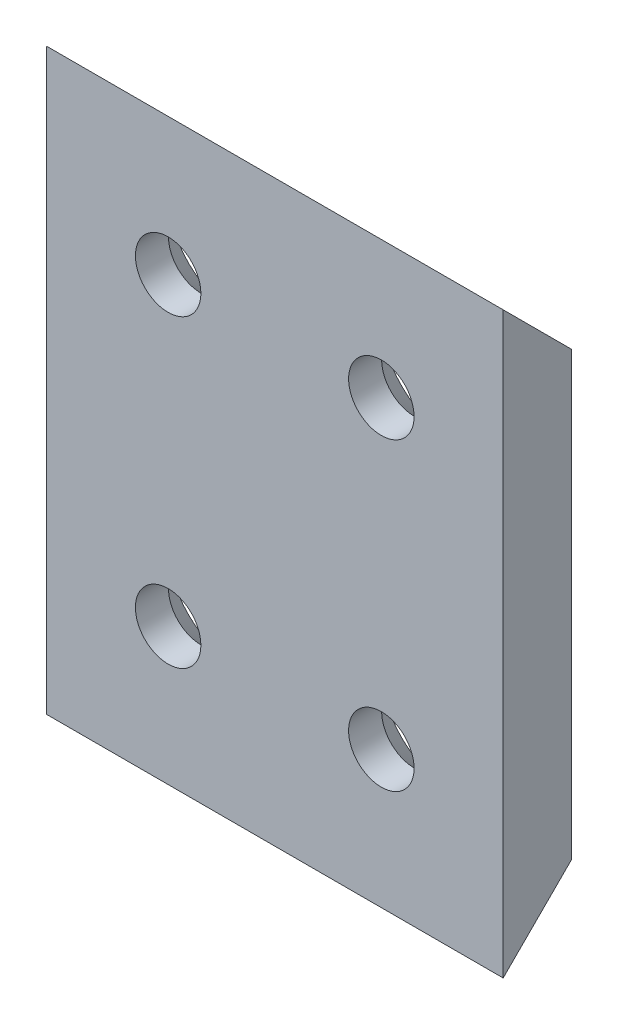
ISO-10303-21;
HEADER;
FILE_DESCRIPTION(('STEP AP214'),'2;1');
FILE_NAME('part.step','',(''),(''),'','','');
FILE_SCHEMA(('AUTOMOTIVE_DESIGN { 1 0 10303 214 1 1 1 1 }'));
ENDSEC;
DATA;
#1=APPLICATION_CONTEXT('core data for automotive mechanical design processes');
#2=APPLICATION_PROTOCOL_DEFINITION('international standard','automotive_design',2000,#1);
#3=PRODUCT_CONTEXT('',#1,'mechanical');
#4=PRODUCT('Part','Part','',(#3));
#5=PRODUCT_RELATED_PRODUCT_CATEGORY('part','',(#4));
#6=PRODUCT_DEFINITION_FORMATION('','',#4);
#7=PRODUCT_DEFINITION_CONTEXT('part definition',#1,'design');
#8=PRODUCT_DEFINITION('design','',#6,#7);
#9=PRODUCT_DEFINITION_SHAPE('','',#8);
#10=(LENGTH_UNIT() NAMED_UNIT(*) SI_UNIT(.MILLI.,.METRE.));
#11=(NAMED_UNIT(*) PLANE_ANGLE_UNIT() SI_UNIT($,.RADIAN.));
#12=(NAMED_UNIT(*) SI_UNIT($,.STERADIAN.) SOLID_ANGLE_UNIT());
#13=UNCERTAINTY_MEASURE_WITH_UNIT(LENGTH_MEASURE(1.E-05),#10,'distance_accuracy_value','');
#14=(GEOMETRIC_REPRESENTATION_CONTEXT(3) GLOBAL_UNCERTAINTY_ASSIGNED_CONTEXT((#13)) GLOBAL_UNIT_ASSIGNED_CONTEXT((#10,
#11,#12)) REPRESENTATION_CONTEXT('',''));
#15=CARTESIAN_POINT('',(0.,0.,0.));
#16=DIRECTION('',(0.,0.,1.));
#17=DIRECTION('',(1.,0.,0.));
#18=AXIS2_PLACEMENT_3D('',#15,#16,#17);
#19=CARTESIAN_POINT('',(0.,0.,-4.5));
#20=DIRECTION('',(0.,0.,1.));
#21=DIRECTION('',(-1.,0.,0.));
#22=AXIS2_PLACEMENT_3D('',#19,#20,#21);
#23=PLANE('',#22);
#24=CARTESIAN_POINT('',(22.,29.,-4.5));
#25=DIRECTION('',(0.,0.,1.));
#26=DIRECTION('',(1.,0.,0.));
#27=AXIS2_PLACEMENT_3D('',#24,#25,#26);
#28=CIRCLE('',#27,4.48);
#29=CARTESIAN_POINT('',(26.48,29.,-4.5));
#30=VERTEX_POINT('',#29);
#31=EDGE_CURVE('E146',#30,#30,#28,.T.);
#32=ORIENTED_EDGE('',*,*,#31,.T.);
#33=EDGE_LOOP('',(#32));
#34=FACE_BOUND('',#33,.T.);
#35=CARTESIAN_POINT('',(22.0000000000002,8.99999999999999,-4.5));
#36=DIRECTION('',(0.,0.,1.));
#37=DIRECTION('',(1.,0.,0.));
#38=AXIS2_PLACEMENT_3D('',#35,#36,#37);
#39=CIRCLE('',#38,4.48);
#40=CARTESIAN_POINT('',(26.4800000000002,8.99999999999999,-4.5));
#41=VERTEX_POINT('',#40);
#42=EDGE_CURVE('E137',#41,#41,#39,.T.);
#43=ORIENTED_EDGE('',*,*,#42,.T.);
#44=EDGE_LOOP('',(#43));
#45=FACE_BOUND('',#44,.T.);
#46=CARTESIAN_POINT('',(8.0000000000002,8.99999999999999,-4.5));
#47=DIRECTION('',(0.,0.,1.));
#48=DIRECTION('',(1.,0.,0.));
#49=AXIS2_PLACEMENT_3D('',#46,#47,#48);
#50=CIRCLE('',#49,4.48);
#51=CARTESIAN_POINT('',(12.4800000000002,8.99999999999999,-4.5));
#52=VERTEX_POINT('',#51);
#53=EDGE_CURVE('E128',#52,#52,#50,.T.);
#54=ORIENTED_EDGE('',*,*,#53,.T.);
#55=EDGE_LOOP('',(#54));
#56=FACE_BOUND('',#55,.T.);
#57=DIRECTION('',(0.,-1.,0.));
#58=VECTOR('',#57,1.);
#59=CARTESIAN_POINT('',(0.,0.,-4.5));
#60=LINE('',#59,#58);
#61=CARTESIAN_POINT('',(0.,33.5,-4.5));
#62=VERTEX_POINT('',#61);
#63=CARTESIAN_POINT('',(0.,4.49999999999999,-4.5));
#64=VERTEX_POINT('',#63);
#65=EDGE_CURVE('E91',#62,#64,#60,.T.);
#66=ORIENTED_EDGE('',*,*,#65,.F.);
#67=DIRECTION('',(-1.,0.,0.));
#68=VECTOR('',#67,1.);
#69=CARTESIAN_POINT('',(0.,33.5,-4.5));
#70=LINE('',#69,#68);
#71=CARTESIAN_POINT('',(30.,33.5,-4.5));
#72=VERTEX_POINT('',#71);
#73=EDGE_CURVE('E116',#72,#62,#70,.T.);
#74=ORIENTED_EDGE('',*,*,#73,.F.);
#75=DIRECTION('',(0.,1.,0.));
#76=VECTOR('',#75,1.);
#77=CARTESIAN_POINT('',(30.,0.,-4.5));
#78=LINE('',#77,#76);
#79=CARTESIAN_POINT('',(30.,4.49999999999999,-4.5));
#80=VERTEX_POINT('',#79);
#81=EDGE_CURVE('E111',#80,#72,#78,.T.);
#82=ORIENTED_EDGE('',*,*,#81,.F.);
#83=DIRECTION('',(1.,0.,0.));
#84=VECTOR('',#83,1.);
#85=CARTESIAN_POINT('',(0.,4.49999999999999,-4.5));
#86=LINE('',#85,#84);
#87=EDGE_CURVE('E118',#64,#80,#86,.T.);
#88=ORIENTED_EDGE('',*,*,#87,.F.);
#89=EDGE_LOOP('',(#66,#74,#82,#88));
#90=FACE_BOUND('',#89,.T.);
#91=CARTESIAN_POINT('',(7.99999999999999,29.,-4.5));
#92=DIRECTION('',(0.,0.,1.));
#93=DIRECTION('',(1.,0.,0.));
#94=AXIS2_PLACEMENT_3D('',#91,#92,#93);
#95=CIRCLE('',#94,4.48);
#96=CARTESIAN_POINT('',(12.48,29.,-4.5));
#97=VERTEX_POINT('',#96);
#98=EDGE_CURVE('E155',#97,#97,#95,.T.);
#99=ORIENTED_EDGE('',*,*,#98,.T.);
#100=EDGE_LOOP('',(#99));
#101=FACE_BOUND('',#100,.T.);
#102=ADVANCED_FACE('F45',(#34,#45,#56,#90,#101),#23,.F.);
#103=CARTESIAN_POINT('',(0.,0.,0.));
#104=DIRECTION('',(0.,0.,1.));
#105=DIRECTION('',(-1.,0.,0.));
#106=AXIS2_PLACEMENT_3D('',#103,#104,#105);
#107=PLANE('',#106);
#108=CARTESIAN_POINT('',(7.99999999999999,29.,0.));
#109=DIRECTION('',(0.,0.,1.));
#110=DIRECTION('',(1.,0.,0.));
#111=AXIS2_PLACEMENT_3D('',#108,#109,#110);
#112=CIRCLE('',#111,2.15);
#113=CARTESIAN_POINT('',(10.15,29.,0.));
#114=VERTEX_POINT('',#113);
#115=EDGE_CURVE('E149',#114,#114,#112,.T.);
#116=ORIENTED_EDGE('',*,*,#115,.F.);
#117=EDGE_LOOP('',(#116));
#118=FACE_BOUND('',#117,.T.);
#119=DIRECTION('',(0.,-1.,0.));
#120=VECTOR('',#119,1.);
#121=CARTESIAN_POINT('',(0.,0.,0.));
#122=LINE('',#121,#120);
#123=CARTESIAN_POINT('',(0.,38.,0.));
#124=VERTEX_POINT('',#123);
#125=CARTESIAN_POINT('',(0.,0.,0.));
#126=VERTEX_POINT('',#125);
#127=EDGE_CURVE('E89',#124,#126,#122,.T.);
#128=ORIENTED_EDGE('',*,*,#127,.T.);
#129=DIRECTION('',(1.,0.,0.));
#130=VECTOR('',#129,1.);
#131=CARTESIAN_POINT('',(0.,0.,0.));
#132=LINE('',#131,#130);
#133=CARTESIAN_POINT('',(30.,0.,0.));
#134=VERTEX_POINT('',#133);
#135=EDGE_CURVE('E95',#126,#134,#132,.T.);
#136=ORIENTED_EDGE('',*,*,#135,.T.);
#137=DIRECTION('',(0.,1.,0.));
#138=VECTOR('',#137,1.);
#139=CARTESIAN_POINT('',(30.,0.,0.));
#140=LINE('',#139,#138);
#141=CARTESIAN_POINT('',(30.,38.,0.));
#142=VERTEX_POINT('',#141);
#143=EDGE_CURVE('E99',#134,#142,#140,.T.);
#144=ORIENTED_EDGE('',*,*,#143,.T.);
#145=DIRECTION('',(-1.,0.,0.));
#146=VECTOR('',#145,1.);
#147=CARTESIAN_POINT('',(0.,38.,0.));
#148=LINE('',#147,#146);
#149=EDGE_CURVE('E104',#142,#124,#148,.T.);
#150=ORIENTED_EDGE('',*,*,#149,.T.);
#151=EDGE_LOOP('',(#128,#136,#144,#150));
#152=FACE_BOUND('',#151,.T.);
#153=CARTESIAN_POINT('',(8.0000000000002,8.99999999999999,0.));
#154=DIRECTION('',(0.,0.,1.));
#155=DIRECTION('',(1.,0.,0.));
#156=AXIS2_PLACEMENT_3D('',#153,#154,#155);
#157=CIRCLE('',#156,2.15);
#158=CARTESIAN_POINT('',(10.1500000000002,8.99999999999999,0.));
#159=VERTEX_POINT('',#158);
#160=EDGE_CURVE('E105',#159,#159,#157,.T.);
#161=ORIENTED_EDGE('',*,*,#160,.F.);
#162=EDGE_LOOP('',(#161));
#163=FACE_BOUND('',#162,.T.);
#164=CARTESIAN_POINT('',(22.0000000000002,8.99999999999999,0.));
#165=DIRECTION('',(0.,0.,1.));
#166=DIRECTION('',(1.,0.,0.));
#167=AXIS2_PLACEMENT_3D('',#164,#165,#166);
#168=CIRCLE('',#167,2.15);
#169=CARTESIAN_POINT('',(24.1500000000002,8.99999999999999,0.));
#170=VERTEX_POINT('',#169);
#171=EDGE_CURVE('E131',#170,#170,#168,.T.);
#172=ORIENTED_EDGE('',*,*,#171,.F.);
#173=EDGE_LOOP('',(#172));
#174=FACE_BOUND('',#173,.T.);
#175=CARTESIAN_POINT('',(22.,29.,0.));
#176=DIRECTION('',(0.,0.,1.));
#177=DIRECTION('',(1.,0.,0.));
#178=AXIS2_PLACEMENT_3D('',#175,#176,#177);
#179=CIRCLE('',#178,2.15);
#180=CARTESIAN_POINT('',(24.15,29.,0.));
#181=VERTEX_POINT('',#180);
#182=EDGE_CURVE('E140',#181,#181,#179,.T.);
#183=ORIENTED_EDGE('',*,*,#182,.F.);
#184=EDGE_LOOP('',(#183));
#185=FACE_BOUND('',#184,.T.);
#186=ADVANCED_FACE('F102',(#118,#152,#163,#174,#185),#107,.T.);
#187=CARTESIAN_POINT('',(0.,0.,-4.5));
#188=DIRECTION('',(1.,0.,0.));
#189=DIRECTION('',(0.,1.,0.));
#190=AXIS2_PLACEMENT_3D('',#187,#188,#189);
#191=PLANE('',#190);
#192=ORIENTED_EDGE('',*,*,#127,.F.);
#193=DIRECTION('',(0.,-0.707106781186546,-0.707106781186549));
#194=VECTOR('',#193,1.);
#195=CARTESIAN_POINT('',(0.,33.5,-4.5));
#196=LINE('',#195,#194);
#197=EDGE_CURVE('E53',#62,#124,#196,.F.);
#198=ORIENTED_EDGE('',*,*,#197,.F.);
#199=ORIENTED_EDGE('',*,*,#65,.T.);
#200=DIRECTION('',(0.,-0.707106781186546,0.707106781186549));
#201=VECTOR('',#200,1.);
#202=CARTESIAN_POINT('',(0.,4.49999999999999,-4.5));
#203=LINE('',#202,#201);
#204=EDGE_CURVE('E11',#126,#64,#203,.F.);
#205=ORIENTED_EDGE('',*,*,#204,.F.);
#206=EDGE_LOOP('',(#192,#198,#199,#205));
#207=FACE_BOUND('',#206,.T.);
#208=ADVANCED_FACE('F87',(#207),#191,.F.);
#209=CARTESIAN_POINT('',(30.,0.,-4.5));
#210=DIRECTION('',(-1.,0.,0.));
#211=DIRECTION('',(0.,-1.,0.));
#212=AXIS2_PLACEMENT_3D('',#209,#210,#211);
#213=PLANE('',#212);
#214=ORIENTED_EDGE('',*,*,#81,.T.);
#215=DIRECTION('',(0.,0.707106781186546,0.707106781186549));
#216=VECTOR('',#215,1.);
#217=CARTESIAN_POINT('',(30.,33.5,-4.5));
#218=LINE('',#217,#216);
#219=EDGE_CURVE('E60',#142,#72,#218,.F.);
#220=ORIENTED_EDGE('',*,*,#219,.F.);
#221=ORIENTED_EDGE('',*,*,#143,.F.);
#222=DIRECTION('',(0.,0.707106781186546,-0.707106781186549));
#223=VECTOR('',#222,1.);
#224=CARTESIAN_POINT('',(30.,4.49999999999999,-4.5));
#225=LINE('',#224,#223);
#226=EDGE_CURVE('E67',#80,#134,#225,.F.);
#227=ORIENTED_EDGE('',*,*,#226,.F.);
#228=EDGE_LOOP('',(#214,#220,#221,#227));
#229=FACE_BOUND('',#228,.T.);
#230=ADVANCED_FACE('F183',(#229),#213,.F.);
#231=CARTESIAN_POINT('',(0.,4.49999999999999,-4.5));
#232=DIRECTION('',(0.,0.707106781186549,0.707106781186546));
#233=DIRECTION('',(1.,0.,0.));
#234=AXIS2_PLACEMENT_3D('',#231,#232,#233);
#235=PLANE('',#234);
#236=ORIENTED_EDGE('',*,*,#204,.T.);
#237=ORIENTED_EDGE('',*,*,#87,.T.);
#238=ORIENTED_EDGE('',*,*,#226,.T.);
#239=ORIENTED_EDGE('',*,*,#135,.F.);
#240=EDGE_LOOP('',(#236,#237,#238,#239));
#241=FACE_BOUND('',#240,.T.);
#242=ADVANCED_FACE('F96',(#241),#235,.F.);
#243=CARTESIAN_POINT('',(0.,33.5,-4.5));
#244=DIRECTION('',(0.,-0.707106781186549,0.707106781186546));
#245=DIRECTION('',(-1.,0.,0.));
#246=AXIS2_PLACEMENT_3D('',#243,#244,#245);
#247=PLANE('',#246);
#248=ORIENTED_EDGE('',*,*,#219,.T.);
#249=ORIENTED_EDGE('',*,*,#73,.T.);
#250=ORIENTED_EDGE('',*,*,#197,.T.);
#251=ORIENTED_EDGE('',*,*,#149,.F.);
#252=EDGE_LOOP('',(#248,#249,#250,#251));
#253=FACE_BOUND('',#252,.T.);
#254=ADVANCED_FACE('F47',(#253),#247,.F.);
#255=CARTESIAN_POINT('',(8.0000000000002,8.99999999999999,-4.5));
#256=DIRECTION('',(0.,0.,-1.));
#257=DIRECTION('',(1.,0.,0.));
#258=AXIS2_PLACEMENT_3D('',#255,#256,#257);
#259=CYLINDRICAL_SURFACE('',#258,2.15);
#260=ORIENTED_EDGE('',*,*,#160,.T.);
#261=EDGE_LOOP('',(#260));
#262=FACE_BOUND('',#261,.T.);
#263=CARTESIAN_POINT('',(8.0000000000002,8.99999999999999,-2.17));
#264=DIRECTION('',(0.,0.,1.));
#265=DIRECTION('',(1.,0.,0.));
#266=AXIS2_PLACEMENT_3D('',#263,#264,#265);
#267=CIRCLE('',#266,2.15);
#268=CARTESIAN_POINT('',(10.1500000000002,8.99999999999999,-2.17));
#269=VERTEX_POINT('',#268);
#270=EDGE_CURVE('E108',#269,#269,#267,.T.);
#271=ORIENTED_EDGE('',*,*,#270,.F.);
#272=EDGE_LOOP('',(#271));
#273=FACE_BOUND('',#272,.T.);
#274=ADVANCED_FACE('F180',(#262,#273),#259,.F.);
#275=CARTESIAN_POINT('',(8.0000000000002,8.99999999999999,-4.5));
#276=DIRECTION('',(0.,0.,-1.));
#277=DIRECTION('',(1.,0.,0.));
#278=AXIS2_PLACEMENT_3D('',#275,#276,#277);
#279=CONICAL_SURFACE('',#278,4.48,0.785398163397449);
#280=ORIENTED_EDGE('',*,*,#270,.T.);
#281=EDGE_LOOP('',(#280));
#282=FACE_BOUND('',#281,.T.);
#283=ORIENTED_EDGE('',*,*,#53,.F.);
#284=EDGE_LOOP('',(#283));
#285=FACE_BOUND('',#284,.T.);
#286=ADVANCED_FACE('F194',(#282,#285),#279,.F.);
#287=CARTESIAN_POINT('',(22.0000000000002,8.99999999999999,-4.5));
#288=DIRECTION('',(0.,0.,-1.));
#289=DIRECTION('',(1.,0.,0.));
#290=AXIS2_PLACEMENT_3D('',#287,#288,#289);
#291=CYLINDRICAL_SURFACE('',#290,2.15);
#292=ORIENTED_EDGE('',*,*,#171,.T.);
#293=EDGE_LOOP('',(#292));
#294=FACE_BOUND('',#293,.T.);
#295=CARTESIAN_POINT('',(22.0000000000002,8.99999999999999,-2.17));
#296=DIRECTION('',(0.,0.,1.));
#297=DIRECTION('',(1.,0.,0.));
#298=AXIS2_PLACEMENT_3D('',#295,#296,#297);
#299=CIRCLE('',#298,2.15);
#300=CARTESIAN_POINT('',(24.1500000000002,8.99999999999999,-2.17));
#301=VERTEX_POINT('',#300);
#302=EDGE_CURVE('E134',#301,#301,#299,.T.);
#303=ORIENTED_EDGE('',*,*,#302,.F.);
#304=EDGE_LOOP('',(#303));
#305=FACE_BOUND('',#304,.T.);
#306=ADVANCED_FACE('F199',(#294,#305),#291,.F.);
#307=CARTESIAN_POINT('',(22.0000000000002,8.99999999999999,-4.5));
#308=DIRECTION('',(0.,0.,-1.));
#309=DIRECTION('',(1.,0.,0.));
#310=AXIS2_PLACEMENT_3D('',#307,#308,#309);
#311=CONICAL_SURFACE('',#310,4.48,0.785398163397449);
#312=ORIENTED_EDGE('',*,*,#302,.T.);
#313=EDGE_LOOP('',(#312));
#314=FACE_BOUND('',#313,.T.);
#315=ORIENTED_EDGE('',*,*,#42,.F.);
#316=EDGE_LOOP('',(#315));
#317=FACE_BOUND('',#316,.T.);
#318=ADVANCED_FACE('F215',(#314,#317),#311,.F.);
#319=CARTESIAN_POINT('',(22.,29.,-4.5));
#320=DIRECTION('',(0.,0.,-1.));
#321=DIRECTION('',(1.,0.,0.));
#322=AXIS2_PLACEMENT_3D('',#319,#320,#321);
#323=CYLINDRICAL_SURFACE('',#322,2.15);
#324=ORIENTED_EDGE('',*,*,#182,.T.);
#325=EDGE_LOOP('',(#324));
#326=FACE_BOUND('',#325,.T.);
#327=CARTESIAN_POINT('',(22.,29.,-2.17));
#328=DIRECTION('',(0.,0.,1.));
#329=DIRECTION('',(1.,0.,0.));
#330=AXIS2_PLACEMENT_3D('',#327,#328,#329);
#331=CIRCLE('',#330,2.15);
#332=CARTESIAN_POINT('',(24.15,29.,-2.17));
#333=VERTEX_POINT('',#332);
#334=EDGE_CURVE('E143',#333,#333,#331,.T.);
#335=ORIENTED_EDGE('',*,*,#334,.F.);
#336=EDGE_LOOP('',(#335));
#337=FACE_BOUND('',#336,.T.);
#338=ADVANCED_FACE('F212',(#326,#337),#323,.F.);
#339=CARTESIAN_POINT('',(22.,29.,-4.5));
#340=DIRECTION('',(0.,0.,-1.));
#341=DIRECTION('',(1.,0.,0.));
#342=AXIS2_PLACEMENT_3D('',#339,#340,#341);
#343=CONICAL_SURFACE('',#342,4.48,0.785398163397449);
#344=ORIENTED_EDGE('',*,*,#334,.T.);
#345=EDGE_LOOP('',(#344));
#346=FACE_BOUND('',#345,.T.);
#347=ORIENTED_EDGE('',*,*,#31,.F.);
#348=EDGE_LOOP('',(#347));
#349=FACE_BOUND('',#348,.T.);
#350=ADVANCED_FACE('F167',(#346,#349),#343,.F.);
#351=CARTESIAN_POINT('',(7.99999999999999,29.,-4.5));
#352=DIRECTION('',(0.,0.,-1.));
#353=DIRECTION('',(1.,0.,0.));
#354=AXIS2_PLACEMENT_3D('',#351,#352,#353);
#355=CYLINDRICAL_SURFACE('',#354,2.15);
#356=ORIENTED_EDGE('',*,*,#115,.T.);
#357=EDGE_LOOP('',(#356));
#358=FACE_BOUND('',#357,.T.);
#359=CARTESIAN_POINT('',(7.99999999999999,29.,-2.17));
#360=DIRECTION('',(0.,0.,1.));
#361=DIRECTION('',(1.,0.,0.));
#362=AXIS2_PLACEMENT_3D('',#359,#360,#361);
#363=CIRCLE('',#362,2.15);
#364=CARTESIAN_POINT('',(10.15,29.,-2.17));
#365=VERTEX_POINT('',#364);
#366=EDGE_CURVE('E152',#365,#365,#363,.T.);
#367=ORIENTED_EDGE('',*,*,#366,.F.);
#368=EDGE_LOOP('',(#367));
#369=FACE_BOUND('',#368,.T.);
#370=ADVANCED_FACE('F161',(#358,#369),#355,.F.);
#371=CARTESIAN_POINT('',(7.99999999999999,29.,-4.5));
#372=DIRECTION('',(0.,0.,-1.));
#373=DIRECTION('',(1.,0.,0.));
#374=AXIS2_PLACEMENT_3D('',#371,#372,#373);
#375=CONICAL_SURFACE('',#374,4.48,0.785398163397449);
#376=ORIENTED_EDGE('',*,*,#366,.T.);
#377=EDGE_LOOP('',(#376));
#378=FACE_BOUND('',#377,.T.);
#379=ORIENTED_EDGE('',*,*,#98,.F.);
#380=EDGE_LOOP('',(#379));
#381=FACE_BOUND('',#380,.T.);
#382=ADVANCED_FACE('F159',(#378,#381),#375,.F.);
#383=CLOSED_SHELL('',(#102,#186,#208,#230,#242,#254,#274,#286,#306,#318,#338,#350,#370,#382));
#384=MANIFOLD_SOLID_BREP('B2',#383);
#385=ADVANCED_BREP_SHAPE_REPRESENTATION('',(#18,#384),#14);
#386=SHAPE_DEFINITION_REPRESENTATION(#9,#385);
ENDSEC;
END-ISO-10303-21;
